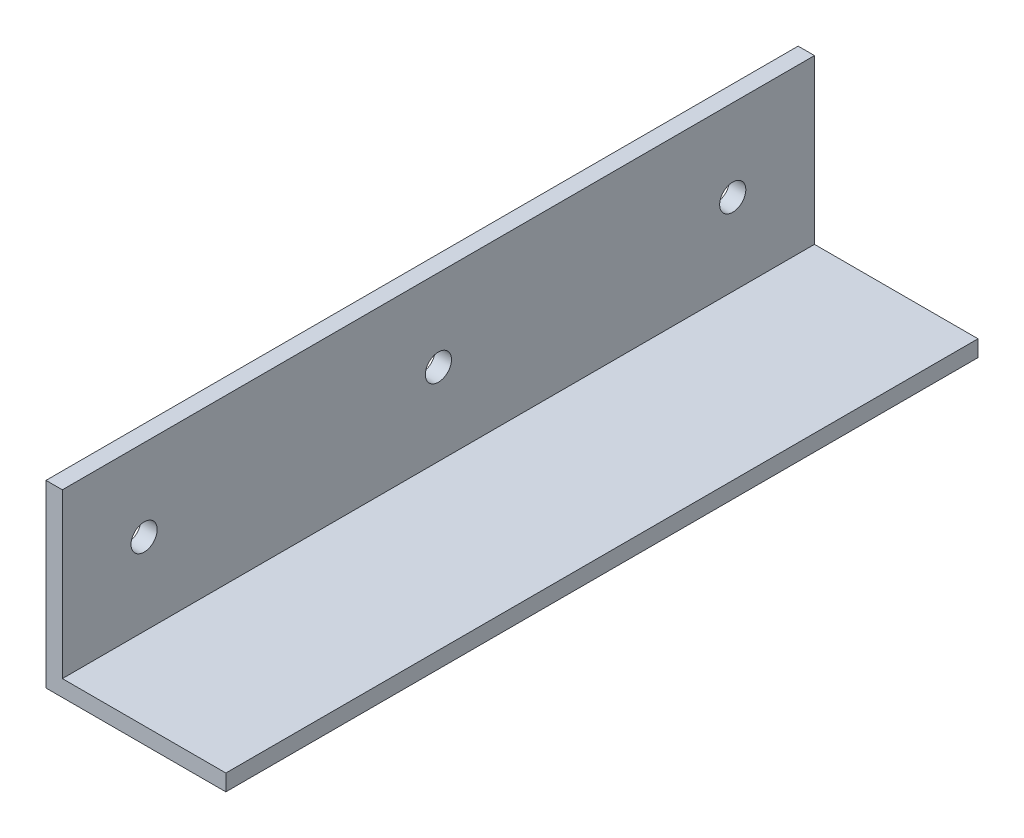
ISO-10303-21;
HEADER;
FILE_DESCRIPTION(('STEP AP214'),'2;1');
FILE_NAME('part.step','',(''),(''),'','','');
FILE_SCHEMA(('AUTOMOTIVE_DESIGN { 1 0 10303 214 1 1 1 1 }'));
ENDSEC;
DATA;
#1=APPLICATION_CONTEXT('core data for automotive mechanical design processes');
#2=APPLICATION_PROTOCOL_DEFINITION('international standard','automotive_design',2000,#1);
#3=PRODUCT_CONTEXT('',#1,'mechanical');
#4=PRODUCT('Part','Part','',(#3));
#5=PRODUCT_RELATED_PRODUCT_CATEGORY('part','',(#4));
#6=PRODUCT_DEFINITION_FORMATION('','',#4);
#7=PRODUCT_DEFINITION_CONTEXT('part definition',#1,'design');
#8=PRODUCT_DEFINITION('design','',#6,#7);
#9=PRODUCT_DEFINITION_SHAPE('','',#8);
#10=(LENGTH_UNIT() NAMED_UNIT(*) SI_UNIT(.MILLI.,.METRE.));
#11=(NAMED_UNIT(*) PLANE_ANGLE_UNIT() SI_UNIT($,.RADIAN.));
#12=(NAMED_UNIT(*) SI_UNIT($,.STERADIAN.) SOLID_ANGLE_UNIT());
#13=UNCERTAINTY_MEASURE_WITH_UNIT(LENGTH_MEASURE(1.E-05),#10,'distance_accuracy_value','');
#14=(GEOMETRIC_REPRESENTATION_CONTEXT(3) GLOBAL_UNCERTAINTY_ASSIGNED_CONTEXT((#13)) GLOBAL_UNIT_ASSIGNED_CONTEXT((#10,
#11,#12)) REPRESENTATION_CONTEXT('',''));
#15=CARTESIAN_POINT('',(0.,0.,0.));
#16=DIRECTION('',(0.,0.,1.));
#17=DIRECTION('',(1.,0.,0.));
#18=AXIS2_PLACEMENT_3D('',#15,#16,#17);
#19=CARTESIAN_POINT('',(0.,0.,230.));
#20=DIRECTION('',(0.,-1.,0.));
#21=DIRECTION('',(0.,0.,-1.));
#22=AXIS2_PLACEMENT_3D('',#19,#20,#21);
#23=PLANE('',#22);
#24=DIRECTION('',(-1.,0.,0.));
#25=VECTOR('',#24,1.);
#26=CARTESIAN_POINT('',(0.,0.,0.));
#27=LINE('',#26,#25);
#28=CARTESIAN_POINT('',(50.,0.,0.));
#29=VERTEX_POINT('',#28);
#30=CARTESIAN_POINT('',(0.,0.,0.));
#31=VERTEX_POINT('',#30);
#32=EDGE_CURVE('E122',#29,#31,#27,.T.);
#33=ORIENTED_EDGE('',*,*,#32,.T.);
#34=DIRECTION('',(0.,0.,-1.));
#35=VECTOR('',#34,1.);
#36=CARTESIAN_POINT('',(0.,0.,230.));
#37=LINE('',#36,#35);
#38=CARTESIAN_POINT('',(0.,0.,230.));
#39=VERTEX_POINT('',#38);
#40=EDGE_CURVE('E11',#39,#31,#37,.T.);
#41=ORIENTED_EDGE('',*,*,#40,.F.);
#42=DIRECTION('',(-1.,0.,0.));
#43=VECTOR('',#42,1.);
#44=CARTESIAN_POINT('',(0.,0.,230.));
#45=LINE('',#44,#43);
#46=CARTESIAN_POINT('',(50.,0.,230.));
#47=VERTEX_POINT('',#46);
#48=EDGE_CURVE('E134',#47,#39,#45,.T.);
#49=ORIENTED_EDGE('',*,*,#48,.F.);
#50=DIRECTION('',(0.,0.,-1.));
#51=VECTOR('',#50,1.);
#52=CARTESIAN_POINT('',(50.,0.,230.));
#53=LINE('',#52,#51);
#54=EDGE_CURVE('E118',#47,#29,#53,.T.);
#55=ORIENTED_EDGE('',*,*,#54,.T.);
#56=EDGE_LOOP('',(#33,#41,#49,#55));
#57=FACE_BOUND('',#56,.T.);
#58=ADVANCED_FACE('F39',(#57),#23,.F.);
#59=CARTESIAN_POINT('',(0.,0.,230.));
#60=DIRECTION('',(-1.,0.,0.));
#61=DIRECTION('',(0.,0.,1.));
#62=AXIS2_PLACEMENT_3D('',#59,#60,#61);
#63=PLANE('',#62);
#64=CARTESIAN_POINT('',(0.,25.,205.));
#65=DIRECTION('',(1.,0.,0.));
#66=DIRECTION('',(0.,0.,-1.));
#67=AXIS2_PLACEMENT_3D('',#64,#65,#66);
#68=CIRCLE('',#67,3.99999999999999);
#69=CARTESIAN_POINT('',(0.,25.,201.));
#70=VERTEX_POINT('',#69);
#71=EDGE_CURVE('E196',#70,#70,#68,.T.);
#72=ORIENTED_EDGE('',*,*,#71,.F.);
#73=EDGE_LOOP('',(#72));
#74=FACE_BOUND('',#73,.T.);
#75=CARTESIAN_POINT('',(0.,25.,25.));
#76=DIRECTION('',(1.,0.,0.));
#77=DIRECTION('',(0.,0.,-1.));
#78=AXIS2_PLACEMENT_3D('',#75,#76,#77);
#79=CIRCLE('',#78,4.);
#80=CARTESIAN_POINT('',(0.,25.,21.));
#81=VERTEX_POINT('',#80);
#82=EDGE_CURVE('E190',#81,#81,#79,.T.);
#83=ORIENTED_EDGE('',*,*,#82,.F.);
#84=EDGE_LOOP('',(#83));
#85=FACE_BOUND('',#84,.T.);
#86=CARTESIAN_POINT('',(0.,25.,115.));
#87=DIRECTION('',(1.,0.,0.));
#88=DIRECTION('',(0.,0.,-1.));
#89=AXIS2_PLACEMENT_3D('',#86,#87,#88);
#90=CIRCLE('',#89,4.00000000000001);
#91=CARTESIAN_POINT('',(0.,25.,111.));
#92=VERTEX_POINT('',#91);
#93=EDGE_CURVE('E187',#92,#92,#90,.T.);
#94=ORIENTED_EDGE('',*,*,#93,.F.);
#95=EDGE_LOOP('',(#94));
#96=FACE_BOUND('',#95,.T.);
#97=DIRECTION('',(0.,1.,0.));
#98=VECTOR('',#97,1.);
#99=CARTESIAN_POINT('',(0.,0.,0.));
#100=LINE('',#99,#98);
#101=CARTESIAN_POINT('',(0.,50.,0.));
#102=VERTEX_POINT('',#101);
#103=EDGE_CURVE('E125',#31,#102,#100,.T.);
#104=ORIENTED_EDGE('',*,*,#103,.T.);
#105=DIRECTION('',(0.,0.,-1.));
#106=VECTOR('',#105,1.);
#107=CARTESIAN_POINT('',(0.,50.,230.));
#108=LINE('',#107,#106);
#109=CARTESIAN_POINT('',(0.,50.,230.));
#110=VERTEX_POINT('',#109);
#111=EDGE_CURVE('E47',#110,#102,#108,.T.);
#112=ORIENTED_EDGE('',*,*,#111,.F.);
#113=DIRECTION('',(0.,1.,0.));
#114=VECTOR('',#113,1.);
#115=CARTESIAN_POINT('',(0.,0.,230.));
#116=LINE('',#115,#114);
#117=EDGE_CURVE('E92',#39,#110,#116,.T.);
#118=ORIENTED_EDGE('',*,*,#117,.F.);
#119=ORIENTED_EDGE('',*,*,#40,.T.);
#120=EDGE_LOOP('',(#104,#112,#118,#119));
#121=FACE_BOUND('',#120,.T.);
#122=ADVANCED_FACE('F158',(#74,#85,#96,#121),#63,.F.);
#123=CARTESIAN_POINT('',(0.,50.,230.));
#124=DIRECTION('',(0.,-1.,0.));
#125=DIRECTION('',(0.,0.,-1.));
#126=AXIS2_PLACEMENT_3D('',#123,#124,#125);
#127=PLANE('',#126);
#128=DIRECTION('',(-1.,0.,0.));
#129=VECTOR('',#128,1.);
#130=CARTESIAN_POINT('',(0.,50.,0.));
#131=LINE('',#130,#129);
#132=CARTESIAN_POINT('',(-5.,50.,0.));
#133=VERTEX_POINT('',#132);
#134=EDGE_CURVE('E128',#102,#133,#131,.T.);
#135=ORIENTED_EDGE('',*,*,#134,.T.);
#136=DIRECTION('',(0.,0.,-1.));
#137=VECTOR('',#136,1.);
#138=CARTESIAN_POINT('',(-5.,50.,230.));
#139=LINE('',#138,#137);
#140=CARTESIAN_POINT('',(-5.,50.,230.));
#141=VERTEX_POINT('',#140);
#142=EDGE_CURVE('E113',#141,#133,#139,.T.);
#143=ORIENTED_EDGE('',*,*,#142,.F.);
#144=DIRECTION('',(-1.,0.,0.));
#145=VECTOR('',#144,1.);
#146=CARTESIAN_POINT('',(0.,50.,230.));
#147=LINE('',#146,#145);
#148=EDGE_CURVE('E105',#110,#141,#147,.T.);
#149=ORIENTED_EDGE('',*,*,#148,.F.);
#150=ORIENTED_EDGE('',*,*,#111,.T.);
#151=EDGE_LOOP('',(#135,#143,#149,#150));
#152=FACE_BOUND('',#151,.T.);
#153=ADVANCED_FACE('F140',(#152),#127,.F.);
#154=CARTESIAN_POINT('',(-5.,0.,230.));
#155=DIRECTION('',(1.,0.,0.));
#156=DIRECTION('',(0.,1.,0.));
#157=AXIS2_PLACEMENT_3D('',#154,#155,#156);
#158=PLANE('',#157);
#159=CARTESIAN_POINT('',(-5.,25.,205.));
#160=DIRECTION('',(1.,0.,0.));
#161=DIRECTION('',(0.,0.,-1.));
#162=AXIS2_PLACEMENT_3D('',#159,#160,#161);
#163=CIRCLE('',#162,3.99999999999999);
#164=CARTESIAN_POINT('',(-5.,25.,201.));
#165=VERTEX_POINT('',#164);
#166=EDGE_CURVE('E179',#165,#165,#163,.T.);
#167=ORIENTED_EDGE('',*,*,#166,.T.);
#168=EDGE_LOOP('',(#167));
#169=FACE_BOUND('',#168,.T.);
#170=CARTESIAN_POINT('',(-5.,25.,25.));
#171=DIRECTION('',(1.,0.,0.));
#172=DIRECTION('',(0.,0.,-1.));
#173=AXIS2_PLACEMENT_3D('',#170,#171,#172);
#174=CIRCLE('',#173,4.);
#175=CARTESIAN_POINT('',(-5.,25.,21.));
#176=VERTEX_POINT('',#175);
#177=EDGE_CURVE('E183',#176,#176,#174,.T.);
#178=ORIENTED_EDGE('',*,*,#177,.T.);
#179=EDGE_LOOP('',(#178));
#180=FACE_BOUND('',#179,.T.);
#181=CARTESIAN_POINT('',(-5.,25.,115.));
#182=DIRECTION('',(1.,0.,0.));
#183=DIRECTION('',(0.,0.,-1.));
#184=AXIS2_PLACEMENT_3D('',#181,#182,#183);
#185=CIRCLE('',#184,4.00000000000001);
#186=CARTESIAN_POINT('',(-5.,25.,111.));
#187=VERTEX_POINT('',#186);
#188=EDGE_CURVE('E126',#187,#187,#185,.T.);
#189=ORIENTED_EDGE('',*,*,#188,.T.);
#190=EDGE_LOOP('',(#189));
#191=FACE_BOUND('',#190,.T.);
#192=DIRECTION('',(0.,-1.,0.));
#193=VECTOR('',#192,1.);
#194=CARTESIAN_POINT('',(-5.,0.,0.));
#195=LINE('',#194,#193);
#196=CARTESIAN_POINT('',(-5.,-5.,0.));
#197=VERTEX_POINT('',#196);
#198=EDGE_CURVE('E112',#133,#197,#195,.T.);
#199=ORIENTED_EDGE('',*,*,#198,.T.);
#200=DIRECTION('',(0.,0.,-1.));
#201=VECTOR('',#200,1.);
#202=CARTESIAN_POINT('',(-5.,-5.,230.));
#203=LINE('',#202,#201);
#204=CARTESIAN_POINT('',(-5.,-5.,230.));
#205=VERTEX_POINT('',#204);
#206=EDGE_CURVE('E110',#205,#197,#203,.T.);
#207=ORIENTED_EDGE('',*,*,#206,.F.);
#208=DIRECTION('',(0.,-1.,0.));
#209=VECTOR('',#208,1.);
#210=CARTESIAN_POINT('',(-5.,0.,230.));
#211=LINE('',#210,#209);
#212=EDGE_CURVE('E99',#141,#205,#211,.T.);
#213=ORIENTED_EDGE('',*,*,#212,.F.);
#214=ORIENTED_EDGE('',*,*,#142,.T.);
#215=EDGE_LOOP('',(#199,#207,#213,#214));
#216=FACE_BOUND('',#215,.T.);
#217=ADVANCED_FACE('F111',(#169,#180,#191,#216),#158,.F.);
#218=CARTESIAN_POINT('',(-5.,-5.,230.));
#219=DIRECTION('',(0.,1.,0.));
#220=DIRECTION('',(0.,0.,1.));
#221=AXIS2_PLACEMENT_3D('',#218,#219,#220);
#222=PLANE('',#221);
#223=DIRECTION('',(1.,0.,0.));
#224=VECTOR('',#223,1.);
#225=CARTESIAN_POINT('',(-5.,-5.,0.));
#226=LINE('',#225,#224);
#227=CARTESIAN_POINT('',(50.,-5.,0.));
#228=VERTEX_POINT('',#227);
#229=EDGE_CURVE('E78',#197,#228,#226,.T.);
#230=ORIENTED_EDGE('',*,*,#229,.T.);
#231=DIRECTION('',(0.,0.,-1.));
#232=VECTOR('',#231,1.);
#233=CARTESIAN_POINT('',(50.,-5.,230.));
#234=LINE('',#233,#232);
#235=CARTESIAN_POINT('',(50.,-5.,230.));
#236=VERTEX_POINT('',#235);
#237=EDGE_CURVE('E114',#236,#228,#234,.T.);
#238=ORIENTED_EDGE('',*,*,#237,.F.);
#239=DIRECTION('',(1.,0.,0.));
#240=VECTOR('',#239,1.);
#241=CARTESIAN_POINT('',(-5.,-5.,230.));
#242=LINE('',#241,#240);
#243=EDGE_CURVE('E103',#205,#236,#242,.T.);
#244=ORIENTED_EDGE('',*,*,#243,.F.);
#245=ORIENTED_EDGE('',*,*,#206,.T.);
#246=EDGE_LOOP('',(#230,#238,#244,#245));
#247=FACE_BOUND('',#246,.T.);
#248=ADVANCED_FACE('F116',(#247),#222,.F.);
#249=CARTESIAN_POINT('',(50.,0.,230.));
#250=DIRECTION('',(-1.,0.,0.));
#251=DIRECTION('',(0.,0.,1.));
#252=AXIS2_PLACEMENT_3D('',#249,#250,#251);
#253=PLANE('',#252);
#254=DIRECTION('',(0.,1.,0.));
#255=VECTOR('',#254,1.);
#256=CARTESIAN_POINT('',(50.,0.,0.));
#257=LINE('',#256,#255);
#258=EDGE_CURVE('E84',#228,#29,#257,.T.);
#259=ORIENTED_EDGE('',*,*,#258,.T.);
#260=ORIENTED_EDGE('',*,*,#54,.F.);
#261=DIRECTION('',(0.,1.,0.));
#262=VECTOR('',#261,1.);
#263=CARTESIAN_POINT('',(50.,0.,230.));
#264=LINE('',#263,#262);
#265=EDGE_CURVE('E55',#236,#47,#264,.T.);
#266=ORIENTED_EDGE('',*,*,#265,.F.);
#267=ORIENTED_EDGE('',*,*,#237,.T.);
#268=EDGE_LOOP('',(#259,#260,#266,#267));
#269=FACE_BOUND('',#268,.T.);
#270=ADVANCED_FACE('F147',(#269),#253,.F.);
#271=CARTESIAN_POINT('',(0.,0.,230.));
#272=DIRECTION('',(0.,0.,-1.));
#273=DIRECTION('',(-1.,0.,0.));
#274=AXIS2_PLACEMENT_3D('',#271,#272,#273);
#275=PLANE('',#274);
#276=ORIENTED_EDGE('',*,*,#48,.T.);
#277=ORIENTED_EDGE('',*,*,#117,.T.);
#278=ORIENTED_EDGE('',*,*,#148,.T.);
#279=ORIENTED_EDGE('',*,*,#212,.T.);
#280=ORIENTED_EDGE('',*,*,#243,.T.);
#281=ORIENTED_EDGE('',*,*,#265,.T.);
#282=EDGE_LOOP('',(#276,#277,#278,#279,#280,#281));
#283=FACE_BOUND('',#282,.T.);
#284=ADVANCED_FACE('F101',(#283),#275,.F.);
#285=CARTESIAN_POINT('',(0.,0.,0.));
#286=DIRECTION('',(0.,0.,-1.));
#287=DIRECTION('',(-1.,0.,0.));
#288=AXIS2_PLACEMENT_3D('',#285,#286,#287);
#289=PLANE('',#288);
#290=ORIENTED_EDGE('',*,*,#32,.F.);
#291=ORIENTED_EDGE('',*,*,#258,.F.);
#292=ORIENTED_EDGE('',*,*,#229,.F.);
#293=ORIENTED_EDGE('',*,*,#198,.F.);
#294=ORIENTED_EDGE('',*,*,#134,.F.);
#295=ORIENTED_EDGE('',*,*,#103,.F.);
#296=EDGE_LOOP('',(#290,#291,#292,#293,#294,#295));
#297=FACE_BOUND('',#296,.T.);
#298=ADVANCED_FACE('F143',(#297),#289,.T.);
#299=CARTESIAN_POINT('',(-5.,25.,115.));
#300=DIRECTION('',(1.,0.,0.));
#301=DIRECTION('',(0.,0.,-1.));
#302=AXIS2_PLACEMENT_3D('',#299,#300,#301);
#303=CYLINDRICAL_SURFACE('',#302,4.00000000000001);
#304=ORIENTED_EDGE('',*,*,#188,.F.);
#305=EDGE_LOOP('',(#304));
#306=FACE_BOUND('',#305,.T.);
#307=ORIENTED_EDGE('',*,*,#93,.T.);
#308=EDGE_LOOP('',(#307));
#309=FACE_BOUND('',#308,.T.);
#310=ADVANCED_FACE('F207',(#306,#309),#303,.F.);
#311=CARTESIAN_POINT('',(-5.,25.,25.));
#312=DIRECTION('',(1.,0.,0.));
#313=DIRECTION('',(0.,0.,-1.));
#314=AXIS2_PLACEMENT_3D('',#311,#312,#313);
#315=CYLINDRICAL_SURFACE('',#314,4.);
#316=ORIENTED_EDGE('',*,*,#177,.F.);
#317=EDGE_LOOP('',(#316));
#318=FACE_BOUND('',#317,.T.);
#319=ORIENTED_EDGE('',*,*,#82,.T.);
#320=EDGE_LOOP('',(#319));
#321=FACE_BOUND('',#320,.T.);
#322=ADVANCED_FACE('F203',(#318,#321),#315,.F.);
#323=CARTESIAN_POINT('',(-5.,25.,205.));
#324=DIRECTION('',(1.,0.,0.));
#325=DIRECTION('',(0.,0.,-1.));
#326=AXIS2_PLACEMENT_3D('',#323,#324,#325);
#327=CYLINDRICAL_SURFACE('',#326,3.99999999999999);
#328=ORIENTED_EDGE('',*,*,#166,.F.);
#329=EDGE_LOOP('',(#328));
#330=FACE_BOUND('',#329,.T.);
#331=ORIENTED_EDGE('',*,*,#71,.T.);
#332=EDGE_LOOP('',(#331));
#333=FACE_BOUND('',#332,.T.);
#334=ADVANCED_FACE('F212',(#330,#333),#327,.F.);
#335=CLOSED_SHELL('',(#58,#122,#153,#217,#248,#270,#284,#298,#310,#322,#334));
#336=MANIFOLD_SOLID_BREP('B2',#335);
#337=ADVANCED_BREP_SHAPE_REPRESENTATION('',(#18,#336),#14);
#338=SHAPE_DEFINITION_REPRESENTATION(#9,#337);
ENDSEC;
END-ISO-10303-21;
